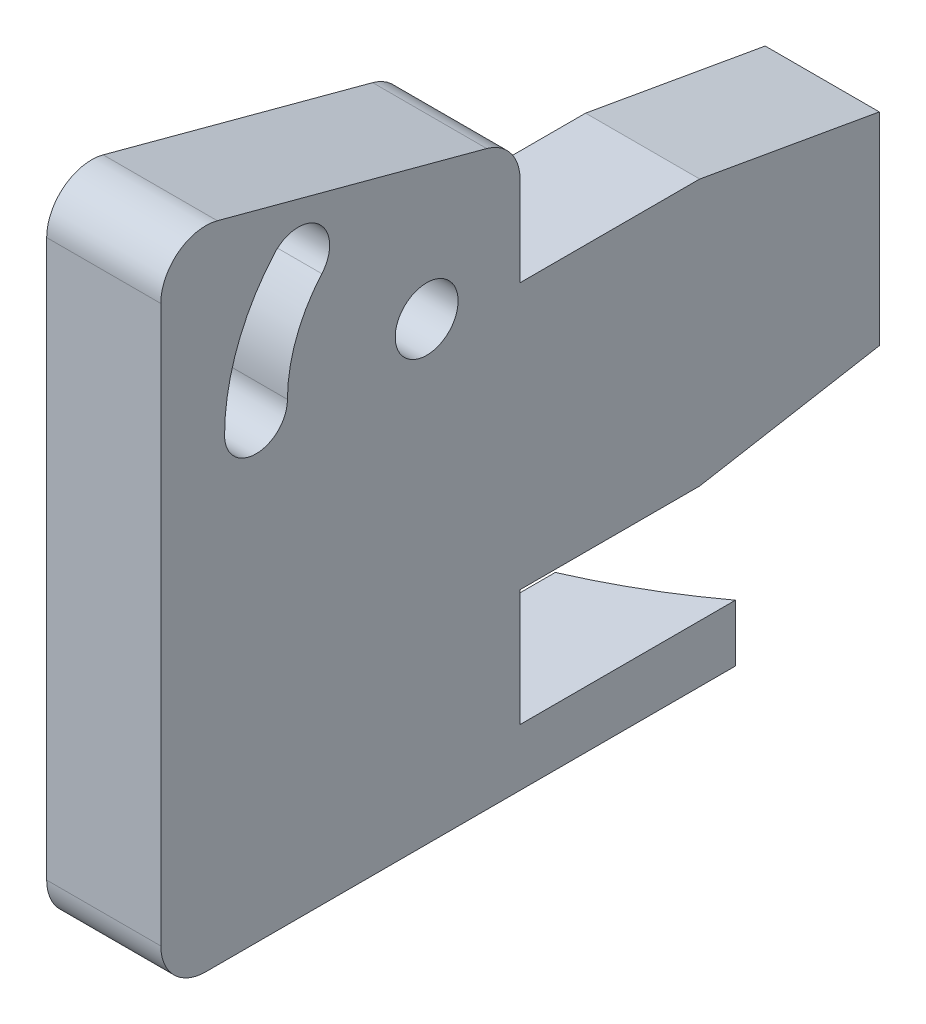
ISO-10303-21;
HEADER;
FILE_DESCRIPTION(('STEP AP214'),'2;1');
FILE_NAME('part.step','',(''),(''),'','','');
FILE_SCHEMA(('AUTOMOTIVE_DESIGN { 1 0 10303 214 1 1 1 1 }'));
ENDSEC;
DATA;
#1=APPLICATION_CONTEXT('core data for automotive mechanical design processes');
#2=APPLICATION_PROTOCOL_DEFINITION('international standard','automotive_design',2000,#1);
#3=PRODUCT_CONTEXT('',#1,'mechanical');
#4=PRODUCT('Part','Part','',(#3));
#5=PRODUCT_RELATED_PRODUCT_CATEGORY('part','',(#4));
#6=PRODUCT_DEFINITION_FORMATION('','',#4);
#7=PRODUCT_DEFINITION_CONTEXT('part definition',#1,'design');
#8=PRODUCT_DEFINITION('design','',#6,#7);
#9=PRODUCT_DEFINITION_SHAPE('','',#8);
#10=(LENGTH_UNIT() NAMED_UNIT(*) SI_UNIT(.MILLI.,.METRE.));
#11=(NAMED_UNIT(*) PLANE_ANGLE_UNIT() SI_UNIT($,.RADIAN.));
#12=(NAMED_UNIT(*) SI_UNIT($,.STERADIAN.) SOLID_ANGLE_UNIT());
#13=UNCERTAINTY_MEASURE_WITH_UNIT(LENGTH_MEASURE(1.E-05),#10,'distance_accuracy_value','');
#14=(GEOMETRIC_REPRESENTATION_CONTEXT(3) GLOBAL_UNCERTAINTY_ASSIGNED_CONTEXT((#13)) GLOBAL_UNIT_ASSIGNED_CONTEXT((#10,
#11,#12)) REPRESENTATION_CONTEXT('',''));
#15=CARTESIAN_POINT('',(0.,0.,0.));
#16=DIRECTION('',(0.,0.,1.));
#17=DIRECTION('',(1.,0.,0.));
#18=AXIS2_PLACEMENT_3D('',#15,#16,#17);
#19=CARTESIAN_POINT('',(6.353,0.,0.));
#20=DIRECTION('',(1.,0.,0.));
#21=DIRECTION('',(0.,0.,-1.));
#22=AXIS2_PLACEMENT_3D('',#19,#20,#21);
#23=PLANE('',#22);
#24=DIRECTION('',(0.,0.,1.));
#25=VECTOR('',#24,1.);
#26=CARTESIAN_POINT('',(6.353,-9.76250000000001,0.));
#27=LINE('',#26,#25);
#28=CARTESIAN_POINT('',(6.353,-9.76250000000001,-9.9999999999998));
#29=VERTEX_POINT('',#28);
#30=CARTESIAN_POINT('',(6.353,-9.76250000000001,0.));
#31=VERTEX_POINT('',#30);
#32=EDGE_CURVE('E307',#29,#31,#27,.T.);
#33=ORIENTED_EDGE('',*,*,#32,.F.);
#34=DIRECTION('',(0.,-0.173648177666927,0.984807753012209));
#35=VECTOR('',#34,1.);
#36=CARTESIAN_POINT('',(6.353,-11.1782253218395,-1.97102272067883));
#37=LINE('',#36,#35);
#38=CARTESIAN_POINT('',(6.353,-7.99923019291535,-20.));
#39=VERTEX_POINT('',#38);
#40=EDGE_CURVE('E12',#29,#39,#37,.F.);
#41=ORIENTED_EDGE('',*,*,#40,.T.);
#42=DIRECTION('',(0.,-1.,0.));
#43=VECTOR('',#42,1.);
#44=CARTESIAN_POINT('',(6.353,0.,-20.));
#45=LINE('',#44,#43);
#46=CARTESIAN_POINT('',(6.353,3.27423019291535,-20.));
#47=VERTEX_POINT('',#46);
#48=EDGE_CURVE('E302',#47,#39,#45,.T.);
#49=ORIENTED_EDGE('',*,*,#48,.F.);
#50=DIRECTION('',(0.,0.173648177666927,0.984807753012209));
#51=VECTOR('',#50,1.);
#52=CARTESIAN_POINT('',(6.353,6.59570150523279,-1.16300013207195));
#53=LINE('',#52,#51);
#54=CARTESIAN_POINT('',(6.353,5.0375,-9.9999999999998));
#55=VERTEX_POINT('',#54);
#56=EDGE_CURVE('E401',#47,#55,#53,.T.);
#57=ORIENTED_EDGE('',*,*,#56,.T.);
#58=DIRECTION('',(0.,0.,1.));
#59=VECTOR('',#58,1.);
#60=CARTESIAN_POINT('',(6.353,5.0375,0.));
#61=LINE('',#60,#59);
#62=CARTESIAN_POINT('',(6.353,5.0375,0.));
#63=VERTEX_POINT('',#62);
#64=EDGE_CURVE('E306',#55,#63,#61,.T.);
#65=ORIENTED_EDGE('',*,*,#64,.T.);
#66=DIRECTION('',(0.,1.,0.));
#67=VECTOR('',#66,1.);
#68=CARTESIAN_POINT('',(6.353,0.,0.));
#69=LINE('',#68,#67);
#70=CARTESIAN_POINT('',(6.353,10.0191825300526,0.));
#71=VERTEX_POINT('',#70);
#72=EDGE_CURVE('E295',#63,#71,#69,.T.);
#73=ORIENTED_EDGE('',*,*,#72,.T.);
#74=CARTESIAN_POINT('',(6.353,10.0191825300526,2.5));
#75=DIRECTION('',(1.,0.,0.));
#76=DIRECTION('',(0.,0.,-1.));
#77=AXIS2_PLACEMENT_3D('',#74,#75,#76);
#78=CIRCLE('',#77,2.5);
#79=CARTESIAN_POINT('',(6.353,12.4339970957753,1.8529523872437));
#80=VERTEX_POINT('',#79);
#81=EDGE_CURVE('E363',#71,#80,#78,.T.);
#82=ORIENTED_EDGE('',*,*,#81,.T.);
#83=DIRECTION('',(0.,-0.258819045102521,-0.965925826289068));
#84=VECTOR('',#83,1.);
#85=CARTESIAN_POINT('',(6.353,11.1378391288384,-2.98437500000001));
#86=LINE('',#85,#84);
#87=CARTESIAN_POINT('',(6.353,16.4532349822421,16.8529523872437));
#88=VERTEX_POINT('',#87);
#89=EDGE_CURVE('E222',#88,#80,#86,.T.);
#90=ORIENTED_EDGE('',*,*,#89,.F.);
#91=CARTESIAN_POINT('',(6.353,14.0384204165195,17.5));
#92=DIRECTION('',(1.,0.,0.));
#93=DIRECTION('',(0.,0.,-1.));
#94=AXIS2_PLACEMENT_3D('',#91,#92,#93);
#95=CIRCLE('',#94,2.5);
#96=CARTESIAN_POINT('',(6.353,14.0384204165195,20.));
#97=VERTEX_POINT('',#96);
#98=EDGE_CURVE('E358',#88,#97,#95,.T.);
#99=ORIENTED_EDGE('',*,*,#98,.T.);
#100=DIRECTION('',(0.,-1.,0.));
#101=VECTOR('',#100,1.);
#102=CARTESIAN_POINT('',(6.353,0.,20.));
#103=LINE('',#102,#101);
#104=CARTESIAN_POINT('',(6.353,-16.9375,20.));
#105=VERTEX_POINT('',#104);
#106=EDGE_CURVE('E212',#97,#105,#103,.T.);
#107=ORIENTED_EDGE('',*,*,#106,.T.);
#108=CARTESIAN_POINT('',(6.353,-16.9375,17.5));
#109=DIRECTION('',(1.,0.,0.));
#110=DIRECTION('',(0.,0.,-1.));
#111=AXIS2_PLACEMENT_3D('',#108,#109,#110);
#112=CIRCLE('',#111,2.5);
#113=CARTESIAN_POINT('',(6.353,-19.4375,17.5));
#114=VERTEX_POINT('',#113);
#115=EDGE_CURVE('E205',#105,#114,#112,.T.);
#116=ORIENTED_EDGE('',*,*,#115,.T.);
#117=DIRECTION('',(0.,0.,-1.));
#118=VECTOR('',#117,1.);
#119=CARTESIAN_POINT('',(6.353,-19.4375,0.));
#120=LINE('',#119,#118);
#121=CARTESIAN_POINT('',(6.353,-19.4375,-11.9903965752063));
#122=VERTEX_POINT('',#121);
#123=EDGE_CURVE('E198',#114,#122,#120,.T.);
#124=ORIENTED_EDGE('',*,*,#123,.T.);
#125=DIRECTION('',(0.,-1.,0.));
#126=VECTOR('',#125,1.);
#127=CARTESIAN_POINT('',(6.353,82.1613815542512,-11.9903965752063));
#128=LINE('',#127,#126);
#129=CARTESIAN_POINT('',(6.353,-16.2625,-11.9903965752063));
#130=VERTEX_POINT('',#129);
#131=EDGE_CURVE('E201',#130,#122,#128,.T.);
#132=ORIENTED_EDGE('',*,*,#131,.F.);
#133=DIRECTION('',(0.,0.,1.));
#134=VECTOR('',#133,1.);
#135=CARTESIAN_POINT('',(6.353,-16.2625,0.));
#136=LINE('',#135,#134);
#137=CARTESIAN_POINT('',(6.353,-16.2625,0.));
#138=VERTEX_POINT('',#137);
#139=EDGE_CURVE('E211',#130,#138,#136,.T.);
#140=ORIENTED_EDGE('',*,*,#139,.T.);
#141=DIRECTION('',(0.,1.,0.));
#142=VECTOR('',#141,1.);
#143=CARTESIAN_POINT('',(6.353,0.,0.));
#144=LINE('',#143,#142);
#145=EDGE_CURVE('E310',#138,#31,#144,.T.);
#146=ORIENTED_EDGE('',*,*,#145,.T.);
#147=EDGE_LOOP('',(#33,#41,#49,#57,#65,#73,#82,#90,#99,#107,#116,#124,#132,#140,#146));
#148=FACE_BOUND('',#147,.T.);
#149=CARTESIAN_POINT('',(6.353,5.8875,5.19999999999999));
#150=DIRECTION('',(1.,0.,0.));
#151=DIRECTION('',(0.,0.,-1.));
#152=AXIS2_PLACEMENT_3D('',#149,#150,#151);
#153=CIRCLE('',#152,1.75);
#154=CARTESIAN_POINT('',(6.353,5.8875,3.44999999999999));
#155=VERTEX_POINT('',#154);
#156=EDGE_CURVE('E235',#155,#155,#153,.T.);
#157=ORIENTED_EDGE('',*,*,#156,.F.);
#158=EDGE_LOOP('',(#157));
#159=FACE_BOUND('',#158,.T.);
#160=CARTESIAN_POINT('',(6.353,12.1411959723446,12.3513136335558));
#161=DIRECTION('',(1.,0.,0.));
#162=DIRECTION('',(0.,0.,-1.));
#163=AXIS2_PLACEMENT_3D('',#160,#161,#162);
#164=CIRCLE('',#163,1.75);
#165=CARTESIAN_POINT('',(6.353,10.98919934586,11.0339663852692));
#166=VERTEX_POINT('',#165);
#167=CARTESIAN_POINT('',(6.353,13.2931925988291,13.6686608818424));
#168=VERTEX_POINT('',#167);
#169=EDGE_CURVE('E265',#166,#168,#164,.T.);
#170=ORIENTED_EDGE('',*,*,#169,.F.);
#171=CARTESIAN_POINT('',(6.353,5.8875,5.19999999999999));
#172=DIRECTION('',(1.,0.,0.));
#173=DIRECTION('',(0.,0.,-1.));
#174=AXIS2_PLACEMENT_3D('',#171,#172,#173);
#175=CIRCLE('',#174,7.75);
#176=CARTESIAN_POINT('',(6.353,5.8875,12.95));
#177=VERTEX_POINT('',#176);
#178=EDGE_CURVE('E261',#166,#177,#175,.T.);
#179=ORIENTED_EDGE('',*,*,#178,.T.);
#180=CARTESIAN_POINT('',(6.353,5.8875,14.7));
#181=DIRECTION('',(1.,0.,0.));
#182=DIRECTION('',(0.,0.,-1.));
#183=AXIS2_PLACEMENT_3D('',#180,#181,#182);
#184=CIRCLE('',#183,1.75);
#185=CARTESIAN_POINT('',(6.353,5.8875,16.45));
#186=VERTEX_POINT('',#185);
#187=EDGE_CURVE('E273',#186,#177,#184,.T.);
#188=ORIENTED_EDGE('',*,*,#187,.F.);
#189=CARTESIAN_POINT('',(6.353,5.8875,5.19999999999999));
#190=DIRECTION('',(1.,0.,0.));
#191=DIRECTION('',(0.,0.,-1.));
#192=AXIS2_PLACEMENT_3D('',#189,#190,#191);
#193=CIRCLE('',#192,11.25);
#194=EDGE_CURVE('E269',#168,#186,#193,.T.);
#195=ORIENTED_EDGE('',*,*,#194,.F.);
#196=EDGE_LOOP('',(#170,#179,#188,#195));
#197=FACE_BOUND('',#196,.T.);
#198=ADVANCED_FACE('F67',(#148,#159,#197),#23,.T.);
#199=CARTESIAN_POINT('',(0.,0.,0.));
#200=DIRECTION('',(1.,0.,0.));
#201=DIRECTION('',(0.,0.,-1.));
#202=AXIS2_PLACEMENT_3D('',#199,#200,#201);
#203=PLANE('',#202);
#204=CARTESIAN_POINT('',(0.,5.8875,5.19999999999999));
#205=DIRECTION('',(1.,0.,0.));
#206=DIRECTION('',(0.,0.,-1.));
#207=AXIS2_PLACEMENT_3D('',#204,#205,#206);
#208=CIRCLE('',#207,1.75);
#209=CARTESIAN_POINT('',(0.,5.8875,3.44999999999999));
#210=VERTEX_POINT('',#209);
#211=EDGE_CURVE('E239',#210,#210,#208,.F.);
#212=ORIENTED_EDGE('',*,*,#211,.F.);
#213=EDGE_LOOP('',(#212));
#214=FACE_BOUND('',#213,.T.);
#215=DIRECTION('',(0.,-1.,0.));
#216=VECTOR('',#215,1.);
#217=CARTESIAN_POINT('',(0.,0.,-20.));
#218=LINE('',#217,#216);
#219=CARTESIAN_POINT('',(0.,3.27423019291535,-20.));
#220=VERTEX_POINT('',#219);
#221=CARTESIAN_POINT('',(0.,-7.99923019291535,-20.));
#222=VERTEX_POINT('',#221);
#223=EDGE_CURVE('E329',#220,#222,#218,.T.);
#224=ORIENTED_EDGE('',*,*,#223,.T.);
#225=DIRECTION('',(0.,0.173648177666927,-0.984807753012209));
#226=VECTOR('',#225,1.);
#227=CARTESIAN_POINT('',(0.,-7.99923019291535,-20.));
#228=LINE('',#227,#226);
#229=CARTESIAN_POINT('',(0.,-9.76250000000001,-9.9999999999998));
#230=VERTEX_POINT('',#229);
#231=EDGE_CURVE('E91',#222,#230,#228,.F.);
#232=ORIENTED_EDGE('',*,*,#231,.T.);
#233=DIRECTION('',(0.,0.,1.));
#234=VECTOR('',#233,1.);
#235=CARTESIAN_POINT('',(0.,-9.76250000000001,0.));
#236=LINE('',#235,#234);
#237=CARTESIAN_POINT('',(0.,-9.76250000000001,0.));
#238=VERTEX_POINT('',#237);
#239=EDGE_CURVE('E332',#230,#238,#236,.T.);
#240=ORIENTED_EDGE('',*,*,#239,.T.);
#241=DIRECTION('',(0.,1.,0.));
#242=VECTOR('',#241,1.);
#243=CARTESIAN_POINT('',(0.,0.,0.));
#244=LINE('',#243,#242);
#245=CARTESIAN_POINT('',(0.,-16.2625,0.));
#246=VERTEX_POINT('',#245);
#247=EDGE_CURVE('E335',#246,#238,#244,.T.);
#248=ORIENTED_EDGE('',*,*,#247,.F.);
#249=DIRECTION('',(0.,0.,1.));
#250=VECTOR('',#249,1.);
#251=CARTESIAN_POINT('',(0.,-16.2625,0.));
#252=LINE('',#251,#250);
#253=CARTESIAN_POINT('',(0.,-16.2625,-8.31325798278704));
#254=VERTEX_POINT('',#253);
#255=EDGE_CURVE('E328',#254,#246,#252,.T.);
#256=ORIENTED_EDGE('',*,*,#255,.F.);
#257=DIRECTION('',(0.,-1.,0.));
#258=VECTOR('',#257,1.);
#259=CARTESIAN_POINT('',(0.,82.1613815542512,-8.31325798278704));
#260=LINE('',#259,#258);
#261=CARTESIAN_POINT('',(0.,-19.4375,-8.31325798278704));
#262=VERTEX_POINT('',#261);
#263=EDGE_CURVE('E223',#254,#262,#260,.T.);
#264=ORIENTED_EDGE('',*,*,#263,.T.);
#265=DIRECTION('',(0.,0.,-1.));
#266=VECTOR('',#265,1.);
#267=CARTESIAN_POINT('',(0.,-19.4375,0.));
#268=LINE('',#267,#266);
#269=CARTESIAN_POINT('',(0.,-19.4375,17.5));
#270=VERTEX_POINT('',#269);
#271=EDGE_CURVE('E227',#270,#262,#268,.T.);
#272=ORIENTED_EDGE('',*,*,#271,.F.);
#273=CARTESIAN_POINT('',(0.,-16.9375,17.5));
#274=DIRECTION('',(1.,0.,0.));
#275=DIRECTION('',(0.,0.,-1.));
#276=AXIS2_PLACEMENT_3D('',#273,#274,#275);
#277=CIRCLE('',#276,2.5);
#278=CARTESIAN_POINT('',(0.,-16.9375,20.));
#279=VERTEX_POINT('',#278);
#280=EDGE_CURVE('E376',#270,#279,#277,.F.);
#281=ORIENTED_EDGE('',*,*,#280,.T.);
#282=DIRECTION('',(0.,-1.,0.));
#283=VECTOR('',#282,1.);
#284=CARTESIAN_POINT('',(0.,0.,20.));
#285=LINE('',#284,#283);
#286=CARTESIAN_POINT('',(0.,14.0384204165195,20.));
#287=VERTEX_POINT('',#286);
#288=EDGE_CURVE('E322',#287,#279,#285,.T.);
#289=ORIENTED_EDGE('',*,*,#288,.F.);
#290=CARTESIAN_POINT('',(0.,14.0384204165195,17.5));
#291=DIRECTION('',(1.,0.,0.));
#292=DIRECTION('',(0.,0.,-1.));
#293=AXIS2_PLACEMENT_3D('',#290,#291,#292);
#294=CIRCLE('',#293,2.5);
#295=CARTESIAN_POINT('',(0.,16.4532349822421,16.8529523872437));
#296=VERTEX_POINT('',#295);
#297=EDGE_CURVE('E373',#287,#296,#294,.F.);
#298=ORIENTED_EDGE('',*,*,#297,.T.);
#299=DIRECTION('',(0.,0.258819045102521,0.965925826289068));
#300=VECTOR('',#299,1.);
#301=CARTESIAN_POINT('',(0.,11.1378391288384,-2.98437500000001));
#302=LINE('',#301,#300);
#303=CARTESIAN_POINT('',(0.,12.4339970957753,1.8529523872437));
#304=VERTEX_POINT('',#303);
#305=EDGE_CURVE('E240',#304,#296,#302,.T.);
#306=ORIENTED_EDGE('',*,*,#305,.F.);
#307=CARTESIAN_POINT('',(0.,10.0191825300526,2.5));
#308=DIRECTION('',(1.,0.,0.));
#309=DIRECTION('',(0.,0.,-1.));
#310=AXIS2_PLACEMENT_3D('',#307,#308,#309);
#311=CIRCLE('',#310,2.5);
#312=CARTESIAN_POINT('',(0.,10.0191825300526,0.));
#313=VERTEX_POINT('',#312);
#314=EDGE_CURVE('E379',#304,#313,#311,.F.);
#315=ORIENTED_EDGE('',*,*,#314,.T.);
#316=DIRECTION('',(0.,1.,0.));
#317=VECTOR('',#316,1.);
#318=CARTESIAN_POINT('',(0.,0.,0.));
#319=LINE('',#318,#317);
#320=CARTESIAN_POINT('',(0.,5.0375,0.));
#321=VERTEX_POINT('',#320);
#322=EDGE_CURVE('E294',#321,#313,#319,.T.);
#323=ORIENTED_EDGE('',*,*,#322,.F.);
#324=DIRECTION('',(0.,0.,1.));
#325=VECTOR('',#324,1.);
#326=CARTESIAN_POINT('',(0.,5.0375,0.));
#327=LINE('',#326,#325);
#328=CARTESIAN_POINT('',(0.,5.0375,-9.9999999999998));
#329=VERTEX_POINT('',#328);
#330=EDGE_CURVE('E299',#329,#321,#327,.T.);
#331=ORIENTED_EDGE('',*,*,#330,.F.);
#332=DIRECTION('',(0.,-0.173648177666927,-0.984807753012209));
#333=VECTOR('',#332,1.);
#334=CARTESIAN_POINT('',(0.,5.0375,-9.9999999999998));
#335=LINE('',#334,#333);
#336=EDGE_CURVE('E395',#329,#220,#335,.T.);
#337=ORIENTED_EDGE('',*,*,#336,.T.);
#338=EDGE_LOOP('',(#224,#232,#240,#248,#256,#264,#272,#281,#289,#298,#306,#315,#323,#331,#337));
#339=FACE_BOUND('',#338,.T.);
#340=CARTESIAN_POINT('',(0.,5.8875,5.19999999999999));
#341=DIRECTION('',(1.,0.,0.));
#342=DIRECTION('',(0.,0.,-1.));
#343=AXIS2_PLACEMENT_3D('',#340,#341,#342);
#344=CIRCLE('',#343,7.75);
#345=CARTESIAN_POINT('',(0.,5.8875,12.95));
#346=VERTEX_POINT('',#345);
#347=CARTESIAN_POINT('',(0.,10.98919934586,11.0339663852692));
#348=VERTEX_POINT('',#347);
#349=EDGE_CURVE('E257',#346,#348,#344,.F.);
#350=ORIENTED_EDGE('',*,*,#349,.T.);
#351=CARTESIAN_POINT('',(0.,12.1411959723446,12.3513136335558));
#352=DIRECTION('',(1.,0.,0.));
#353=DIRECTION('',(0.,0.,-1.));
#354=AXIS2_PLACEMENT_3D('',#351,#352,#353);
#355=CIRCLE('',#354,1.75);
#356=CARTESIAN_POINT('',(0.,13.2931925988291,13.6686608818424));
#357=VERTEX_POINT('',#356);
#358=EDGE_CURVE('E281',#357,#348,#355,.F.);
#359=ORIENTED_EDGE('',*,*,#358,.F.);
#360=CARTESIAN_POINT('',(0.,5.8875,5.19999999999999));
#361=DIRECTION('',(1.,0.,0.));
#362=DIRECTION('',(0.,0.,-1.));
#363=AXIS2_PLACEMENT_3D('',#360,#361,#362);
#364=CIRCLE('',#363,11.25);
#365=CARTESIAN_POINT('',(0.,5.8875,16.45));
#366=VERTEX_POINT('',#365);
#367=EDGE_CURVE('E244',#366,#357,#364,.F.);
#368=ORIENTED_EDGE('',*,*,#367,.F.);
#369=CARTESIAN_POINT('',(0.,5.8875,14.7));
#370=DIRECTION('',(1.,0.,0.));
#371=DIRECTION('',(0.,0.,-1.));
#372=AXIS2_PLACEMENT_3D('',#369,#370,#371);
#373=CIRCLE('',#372,1.75);
#374=EDGE_CURVE('E253',#346,#366,#373,.F.);
#375=ORIENTED_EDGE('',*,*,#374,.F.);
#376=EDGE_LOOP('',(#350,#359,#368,#375));
#377=FACE_BOUND('',#376,.T.);
#378=ADVANCED_FACE('F418',(#214,#339,#377),#203,.F.);
#379=CARTESIAN_POINT('',(6.353,0.,0.));
#380=DIRECTION('',(0.,0.,1.));
#381=DIRECTION('',(0.,-1.,0.));
#382=AXIS2_PLACEMENT_3D('',#379,#380,#381);
#383=PLANE('',#382);
#384=ORIENTED_EDGE('',*,*,#322,.T.);
#385=DIRECTION('',(1.,0.,0.));
#386=VECTOR('',#385,1.);
#387=CARTESIAN_POINT('',(6.353,10.0191825300526,0.));
#388=LINE('',#387,#386);
#389=EDGE_CURVE('E354',#313,#71,#388,.T.);
#390=ORIENTED_EDGE('',*,*,#389,.T.);
#391=ORIENTED_EDGE('',*,*,#72,.F.);
#392=DIRECTION('',(-1.,0.,0.));
#393=VECTOR('',#392,1.);
#394=CARTESIAN_POINT('',(6.353,5.0375,0.));
#395=LINE('',#394,#393);
#396=EDGE_CURVE('E318',#63,#321,#395,.T.);
#397=ORIENTED_EDGE('',*,*,#396,.T.);
#398=EDGE_LOOP('',(#384,#390,#391,#397));
#399=FACE_BOUND('',#398,.T.);
#400=ADVANCED_FACE('F441',(#399),#383,.F.);
#401=CARTESIAN_POINT('',(6.353,0.,20.));
#402=DIRECTION('',(0.,0.,-1.));
#403=DIRECTION('',(-1.,0.,0.));
#404=AXIS2_PLACEMENT_3D('',#401,#402,#403);
#405=PLANE('',#404);
#406=ORIENTED_EDGE('',*,*,#288,.T.);
#407=DIRECTION('',(-1.,0.,0.));
#408=VECTOR('',#407,1.);
#409=CARTESIAN_POINT('',(6.353,-16.9375,20.));
#410=LINE('',#409,#408);
#411=EDGE_CURVE('E388',#279,#105,#410,.F.);
#412=ORIENTED_EDGE('',*,*,#411,.T.);
#413=ORIENTED_EDGE('',*,*,#106,.F.);
#414=DIRECTION('',(1.,0.,0.));
#415=VECTOR('',#414,1.);
#416=CARTESIAN_POINT('',(6.353,14.0384204165195,20.));
#417=LINE('',#416,#415);
#418=EDGE_CURVE('E385',#97,#287,#417,.F.);
#419=ORIENTED_EDGE('',*,*,#418,.T.);
#420=EDGE_LOOP('',(#406,#412,#413,#419));
#421=FACE_BOUND('',#420,.T.);
#422=ADVANCED_FACE('F465',(#421),#405,.F.);
#423=CARTESIAN_POINT('',(6.353,-19.4375,0.));
#424=DIRECTION('',(0.,1.,0.));
#425=DIRECTION('',(0.,0.,1.));
#426=AXIS2_PLACEMENT_3D('',#423,#424,#425);
#427=PLANE('',#426);
#428=ORIENTED_EDGE('',*,*,#123,.F.);
#429=DIRECTION('',(-1.,0.,0.));
#430=VECTOR('',#429,1.);
#431=CARTESIAN_POINT('',(6.353,-19.4375,17.5));
#432=LINE('',#431,#430);
#433=EDGE_CURVE('E382',#114,#270,#432,.T.);
#434=ORIENTED_EDGE('',*,*,#433,.T.);
#435=ORIENTED_EDGE('',*,*,#271,.T.);
#436=CARTESIAN_POINT('',(-13.,-19.4375,-38.1));
#437=DIRECTION('',(0.,-1.,0.));
#438=DIRECTION('',(0.,0.,-1.));
#439=AXIS2_PLACEMENT_3D('',#436,#437,#438);
#440=CIRCLE('',#439,32.5);
#441=EDGE_CURVE('E217',#122,#262,#440,.T.);
#442=ORIENTED_EDGE('',*,*,#441,.F.);
#443=EDGE_LOOP('',(#428,#434,#435,#442));
#444=FACE_BOUND('',#443,.T.);
#445=ADVANCED_FACE('F225',(#444),#427,.F.);
#446=CARTESIAN_POINT('',(6.353,-16.2625,0.));
#447=DIRECTION('',(0.,-1.,0.));
#448=DIRECTION('',(0.,0.,-1.));
#449=AXIS2_PLACEMENT_3D('',#446,#447,#448);
#450=PLANE('',#449);
#451=ORIENTED_EDGE('',*,*,#139,.F.);
#452=CARTESIAN_POINT('',(-13.,-16.2625,-38.1));
#453=DIRECTION('',(0.,-1.,0.));
#454=DIRECTION('',(0.,0.,-1.));
#455=AXIS2_PLACEMENT_3D('',#452,#453,#454);
#456=CIRCLE('',#455,32.5);
#457=EDGE_CURVE('E220',#130,#254,#456,.T.);
#458=ORIENTED_EDGE('',*,*,#457,.T.);
#459=ORIENTED_EDGE('',*,*,#255,.T.);
#460=DIRECTION('',(-1.,0.,0.));
#461=VECTOR('',#460,1.);
#462=CARTESIAN_POINT('',(6.353,-16.2625,0.));
#463=LINE('',#462,#461);
#464=EDGE_CURVE('E350',#138,#246,#463,.T.);
#465=ORIENTED_EDGE('',*,*,#464,.F.);
#466=EDGE_LOOP('',(#451,#458,#459,#465));
#467=FACE_BOUND('',#466,.T.);
#468=ADVANCED_FACE('F458',(#467),#450,.F.);
#469=CARTESIAN_POINT('',(6.353,0.,0.));
#470=DIRECTION('',(0.,0.,1.));
#471=DIRECTION('',(1.,0.,0.));
#472=AXIS2_PLACEMENT_3D('',#469,#470,#471);
#473=PLANE('',#472);
#474=ORIENTED_EDGE('',*,*,#247,.T.);
#475=DIRECTION('',(-1.,0.,0.));
#476=VECTOR('',#475,1.);
#477=CARTESIAN_POINT('',(6.353,-9.76250000000001,0.));
#478=LINE('',#477,#476);
#479=EDGE_CURVE('E346',#31,#238,#478,.T.);
#480=ORIENTED_EDGE('',*,*,#479,.F.);
#481=ORIENTED_EDGE('',*,*,#145,.F.);
#482=ORIENTED_EDGE('',*,*,#464,.T.);
#483=EDGE_LOOP('',(#474,#480,#481,#482));
#484=FACE_BOUND('',#483,.T.);
#485=ADVANCED_FACE('F455',(#484),#473,.F.);
#486=CARTESIAN_POINT('',(6.353,-9.76250000000001,0.));
#487=DIRECTION('',(0.,-1.,0.));
#488=DIRECTION('',(0.,0.,-1.));
#489=AXIS2_PLACEMENT_3D('',#486,#487,#488);
#490=PLANE('',#489);
#491=ORIENTED_EDGE('',*,*,#239,.F.);
#492=DIRECTION('',(1.,0.,0.));
#493=VECTOR('',#492,1.);
#494=CARTESIAN_POINT('',(6.353,-9.76250000000001,-9.9999999999998));
#495=LINE('',#494,#493);
#496=EDGE_CURVE('E77',#230,#29,#495,.T.);
#497=ORIENTED_EDGE('',*,*,#496,.T.);
#498=ORIENTED_EDGE('',*,*,#32,.T.);
#499=ORIENTED_EDGE('',*,*,#479,.T.);
#500=EDGE_LOOP('',(#491,#497,#498,#499));
#501=FACE_BOUND('',#500,.T.);
#502=ADVANCED_FACE('F452',(#501),#490,.T.);
#503=CARTESIAN_POINT('',(6.353,0.,-20.));
#504=DIRECTION('',(0.,0.,-1.));
#505=DIRECTION('',(-1.,0.,0.));
#506=AXIS2_PLACEMENT_3D('',#503,#504,#505);
#507=PLANE('',#506);
#508=ORIENTED_EDGE('',*,*,#48,.T.);
#509=DIRECTION('',(-1.,0.,0.));
#510=VECTOR('',#509,1.);
#511=CARTESIAN_POINT('',(6.353,-7.99923019291535,-20.));
#512=LINE('',#511,#510);
#513=EDGE_CURVE('E404',#39,#222,#512,.T.);
#514=ORIENTED_EDGE('',*,*,#513,.T.);
#515=ORIENTED_EDGE('',*,*,#223,.F.);
#516=DIRECTION('',(1.,0.,0.));
#517=VECTOR('',#516,1.);
#518=CARTESIAN_POINT('',(6.353,3.27423019291535,-20.));
#519=LINE('',#518,#517);
#520=EDGE_CURVE('E398',#220,#47,#519,.T.);
#521=ORIENTED_EDGE('',*,*,#520,.T.);
#522=EDGE_LOOP('',(#508,#514,#515,#521));
#523=FACE_BOUND('',#522,.T.);
#524=ADVANCED_FACE('F413',(#523),#507,.T.);
#525=CARTESIAN_POINT('',(6.353,5.0375,0.));
#526=DIRECTION('',(0.,-1.,0.));
#527=DIRECTION('',(0.,0.,-1.));
#528=AXIS2_PLACEMENT_3D('',#525,#526,#527);
#529=PLANE('',#528);
#530=ORIENTED_EDGE('',*,*,#64,.F.);
#531=DIRECTION('',(-1.,0.,0.));
#532=VECTOR('',#531,1.);
#533=CARTESIAN_POINT('',(0.,5.0375,-9.9999999999998));
#534=LINE('',#533,#532);
#535=EDGE_CURVE('E391',#55,#329,#534,.T.);
#536=ORIENTED_EDGE('',*,*,#535,.T.);
#537=ORIENTED_EDGE('',*,*,#330,.T.);
#538=ORIENTED_EDGE('',*,*,#396,.F.);
#539=EDGE_LOOP('',(#530,#536,#537,#538));
#540=FACE_BOUND('',#539,.T.);
#541=ADVANCED_FACE('F428',(#540),#529,.F.);
#542=CARTESIAN_POINT('',(-0.00100000000000013,5.8875,5.19999999999999));
#543=DIRECTION('',(1.,0.,0.));
#544=DIRECTION('',(0.,0.,-1.));
#545=AXIS2_PLACEMENT_3D('',#542,#543,#544);
#546=CYLINDRICAL_SURFACE('',#545,7.75);
#547=DIRECTION('',(1.,0.,0.));
#548=VECTOR('',#547,1.);
#549=CARTESIAN_POINT('',(-0.00100000000000013,5.8875,12.95));
#550=LINE('',#549,#548);
#551=EDGE_CURVE('E278',#346,#177,#550,.T.);
#552=ORIENTED_EDGE('',*,*,#551,.T.);
#553=ORIENTED_EDGE('',*,*,#178,.F.);
#554=DIRECTION('',(1.,0.,0.));
#555=VECTOR('',#554,1.);
#556=CARTESIAN_POINT('',(-0.00100000000000013,10.98919934586,11.0339663852692));
#557=LINE('',#556,#555);
#558=EDGE_CURVE('E277',#348,#166,#557,.T.);
#559=ORIENTED_EDGE('',*,*,#558,.F.);
#560=ORIENTED_EDGE('',*,*,#349,.F.);
#561=EDGE_LOOP('',(#552,#553,#559,#560));
#562=FACE_BOUND('',#561,.T.);
#563=ADVANCED_FACE('F445',(#562),#546,.T.);
#564=CARTESIAN_POINT('',(-0.00100000000000013,5.8875,14.7));
#565=DIRECTION('',(1.,0.,0.));
#566=DIRECTION('',(0.,0.,-1.));
#567=AXIS2_PLACEMENT_3D('',#564,#565,#566);
#568=CYLINDRICAL_SURFACE('',#567,1.75);
#569=ORIENTED_EDGE('',*,*,#374,.T.);
#570=DIRECTION('',(1.,0.,0.));
#571=VECTOR('',#570,1.);
#572=CARTESIAN_POINT('',(-0.00100000000000013,5.8875,16.45));
#573=LINE('',#572,#571);
#574=EDGE_CURVE('E282',#366,#186,#573,.T.);
#575=ORIENTED_EDGE('',*,*,#574,.T.);
#576=ORIENTED_EDGE('',*,*,#187,.T.);
#577=ORIENTED_EDGE('',*,*,#551,.F.);
#578=EDGE_LOOP('',(#569,#575,#576,#577));
#579=FACE_BOUND('',#578,.T.);
#580=ADVANCED_FACE('F519',(#579),#568,.F.);
#581=CARTESIAN_POINT('',(-0.00100000000000013,5.8875,5.19999999999999));
#582=DIRECTION('',(1.,0.,0.));
#583=DIRECTION('',(0.,0.,-1.));
#584=AXIS2_PLACEMENT_3D('',#581,#582,#583);
#585=CYLINDRICAL_SURFACE('',#584,11.25);
#586=ORIENTED_EDGE('',*,*,#367,.T.);
#587=DIRECTION('',(1.,0.,0.));
#588=VECTOR('',#587,1.);
#589=CARTESIAN_POINT('',(-0.00100000000000013,13.2931925988291,13.6686608818424));
#590=LINE('',#589,#588);
#591=EDGE_CURVE('E285',#357,#168,#590,.T.);
#592=ORIENTED_EDGE('',*,*,#591,.T.);
#593=ORIENTED_EDGE('',*,*,#194,.T.);
#594=ORIENTED_EDGE('',*,*,#574,.F.);
#595=EDGE_LOOP('',(#586,#592,#593,#594));
#596=FACE_BOUND('',#595,.T.);
#597=ADVANCED_FACE('F522',(#596),#585,.F.);
#598=CARTESIAN_POINT('',(-0.00100000000000013,12.1411959723446,12.3513136335558));
#599=DIRECTION('',(1.,0.,0.));
#600=DIRECTION('',(0.,0.,-1.));
#601=AXIS2_PLACEMENT_3D('',#598,#599,#600);
#602=CYLINDRICAL_SURFACE('',#601,1.75);
#603=ORIENTED_EDGE('',*,*,#358,.T.);
#604=ORIENTED_EDGE('',*,*,#558,.T.);
#605=ORIENTED_EDGE('',*,*,#169,.T.);
#606=ORIENTED_EDGE('',*,*,#591,.F.);
#607=EDGE_LOOP('',(#603,#604,#605,#606));
#608=FACE_BOUND('',#607,.T.);
#609=ADVANCED_FACE('F515',(#608),#602,.F.);
#610=CARTESIAN_POINT('',(-0.00100000000000013,5.8875,5.19999999999999));
#611=DIRECTION('',(1.,0.,0.));
#612=DIRECTION('',(0.,0.,-1.));
#613=AXIS2_PLACEMENT_3D('',#610,#611,#612);
#614=CYLINDRICAL_SURFACE('',#613,1.75);
#615=ORIENTED_EDGE('',*,*,#156,.T.);
#616=EDGE_LOOP('',(#615));
#617=FACE_BOUND('',#616,.T.);
#618=ORIENTED_EDGE('',*,*,#211,.T.);
#619=EDGE_LOOP('',(#618));
#620=FACE_BOUND('',#619,.T.);
#621=ADVANCED_FACE('F508',(#617,#620),#614,.F.);
#622=CARTESIAN_POINT('',(-0.00100000000000013,11.1378391288384,-2.98437500000001));
#623=DIRECTION('',(0.,-0.965925826289068,0.258819045102521));
#624=DIRECTION('',(0.,-0.258819045102521,-0.965925826289068));
#625=AXIS2_PLACEMENT_3D('',#622,#623,#624);
#626=PLANE('',#625);
#627=ORIENTED_EDGE('',*,*,#89,.T.);
#628=DIRECTION('',(1.,0.,0.));
#629=VECTOR('',#628,1.);
#630=CARTESIAN_POINT('',(-0.00100000000000013,12.4339970957753,1.8529523872437));
#631=LINE('',#630,#629);
#632=EDGE_CURVE('E370',#80,#304,#631,.F.);
#633=ORIENTED_EDGE('',*,*,#632,.T.);
#634=ORIENTED_EDGE('',*,*,#305,.T.);
#635=DIRECTION('',(1.,0.,0.));
#636=VECTOR('',#635,1.);
#637=CARTESIAN_POINT('',(-0.00100000000000013,16.4532349822421,16.8529523872437));
#638=LINE('',#637,#636);
#639=EDGE_CURVE('E366',#296,#88,#638,.T.);
#640=ORIENTED_EDGE('',*,*,#639,.T.);
#641=EDGE_LOOP('',(#627,#633,#634,#640));
#642=FACE_BOUND('',#641,.T.);
#643=ADVANCED_FACE('F496',(#642),#626,.F.);
#644=CARTESIAN_POINT('',(-13.,82.1613815542512,-38.1));
#645=DIRECTION('',(0.,-1.,0.));
#646=DIRECTION('',(0.,0.,-1.));
#647=AXIS2_PLACEMENT_3D('',#644,#645,#646);
#648=CYLINDRICAL_SURFACE('',#647,32.5);
#649=ORIENTED_EDGE('',*,*,#131,.T.);
#650=ORIENTED_EDGE('',*,*,#441,.T.);
#651=ORIENTED_EDGE('',*,*,#263,.F.);
#652=ORIENTED_EDGE('',*,*,#457,.F.);
#653=EDGE_LOOP('',(#649,#650,#651,#652));
#654=FACE_BOUND('',#653,.T.);
#655=ADVANCED_FACE('F216',(#654),#648,.F.);
#656=CARTESIAN_POINT('',(6.353,10.0191825300526,2.5));
#657=DIRECTION('',(1.,0.,0.));
#658=DIRECTION('',(0.,0.,-1.));
#659=AXIS2_PLACEMENT_3D('',#656,#657,#658);
#660=CYLINDRICAL_SURFACE('',#659,2.5);
#661=ORIENTED_EDGE('',*,*,#314,.F.);
#662=ORIENTED_EDGE('',*,*,#632,.F.);
#663=ORIENTED_EDGE('',*,*,#81,.F.);
#664=ORIENTED_EDGE('',*,*,#389,.F.);
#665=EDGE_LOOP('',(#661,#662,#663,#664));
#666=FACE_BOUND('',#665,.T.);
#667=ADVANCED_FACE('F472',(#666),#660,.T.);
#668=CARTESIAN_POINT('',(6.353,-16.9375,17.5));
#669=DIRECTION('',(-1.,0.,0.));
#670=DIRECTION('',(0.,0.,1.));
#671=AXIS2_PLACEMENT_3D('',#668,#669,#670);
#672=CYLINDRICAL_SURFACE('',#671,2.5);
#673=ORIENTED_EDGE('',*,*,#115,.F.);
#674=ORIENTED_EDGE('',*,*,#411,.F.);
#675=ORIENTED_EDGE('',*,*,#280,.F.);
#676=ORIENTED_EDGE('',*,*,#433,.F.);
#677=EDGE_LOOP('',(#673,#674,#675,#676));
#678=FACE_BOUND('',#677,.T.);
#679=ADVANCED_FACE('F475',(#678),#672,.T.);
#680=CARTESIAN_POINT('',(-0.00100000000000013,14.0384204165195,17.5));
#681=DIRECTION('',(1.,0.,0.));
#682=DIRECTION('',(0.,0.,-1.));
#683=AXIS2_PLACEMENT_3D('',#680,#681,#682);
#684=CYLINDRICAL_SURFACE('',#683,2.5);
#685=ORIENTED_EDGE('',*,*,#297,.F.);
#686=ORIENTED_EDGE('',*,*,#418,.F.);
#687=ORIENTED_EDGE('',*,*,#98,.F.);
#688=ORIENTED_EDGE('',*,*,#639,.F.);
#689=EDGE_LOOP('',(#685,#686,#687,#688));
#690=FACE_BOUND('',#689,.T.);
#691=ADVANCED_FACE('F435',(#690),#684,.T.);
#692=CARTESIAN_POINT('',(6.353,5.0375,-9.9999999999998));
#693=DIRECTION('',(0.,0.984807753012209,-0.173648177666927));
#694=DIRECTION('',(1.,0.,0.));
#695=AXIS2_PLACEMENT_3D('',#692,#693,#694);
#696=PLANE('',#695);
#697=ORIENTED_EDGE('',*,*,#56,.F.);
#698=ORIENTED_EDGE('',*,*,#520,.F.);
#699=ORIENTED_EDGE('',*,*,#336,.F.);
#700=ORIENTED_EDGE('',*,*,#535,.F.);
#701=EDGE_LOOP('',(#697,#698,#699,#700));
#702=FACE_BOUND('',#701,.T.);
#703=ADVANCED_FACE('F425',(#702),#696,.T.);
#704=CARTESIAN_POINT('',(6.353,-7.99923019291535,-20.));
#705=DIRECTION('',(0.,0.984807753012209,0.173648177666927));
#706=DIRECTION('',(-1.,0.,0.));
#707=AXIS2_PLACEMENT_3D('',#704,#705,#706);
#708=PLANE('',#707);
#709=ORIENTED_EDGE('',*,*,#40,.F.);
#710=ORIENTED_EDGE('',*,*,#496,.F.);
#711=ORIENTED_EDGE('',*,*,#231,.F.);
#712=ORIENTED_EDGE('',*,*,#513,.F.);
#713=EDGE_LOOP('',(#709,#710,#711,#712));
#714=FACE_BOUND('',#713,.T.);
#715=ADVANCED_FACE('F70',(#714),#708,.F.);
#716=CLOSED_SHELL('',(#198,#378,#400,#422,#445,#468,#485,#502,#524,#541,#563,#580,#597,#609,
#621,#643,#655,#667,#679,#691,#703,#715));
#717=MANIFOLD_SOLID_BREP('B2',#716);
#718=ADVANCED_BREP_SHAPE_REPRESENTATION('',(#18,#717),#14);
#719=SHAPE_DEFINITION_REPRESENTATION(#9,#718);
ENDSEC;
END-ISO-10303-21;
